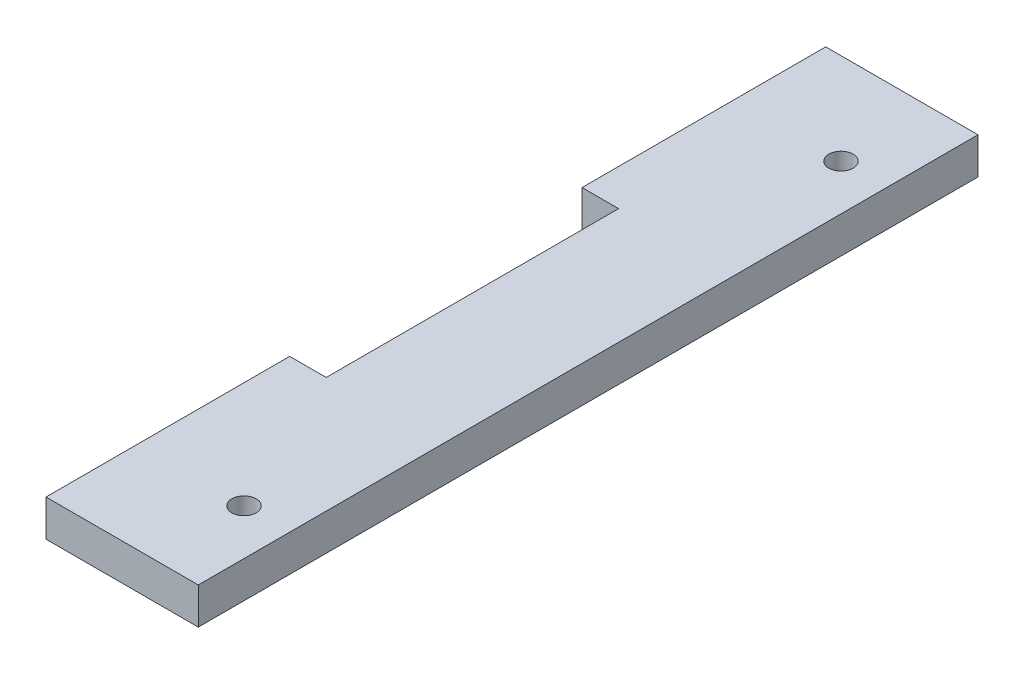
ISO-10303-21;
HEADER;
FILE_DESCRIPTION(('STEP AP214'),'2;1');
FILE_NAME('part.step','',(''),(''),'','','');
FILE_SCHEMA(('AUTOMOTIVE_DESIGN { 1 0 10303 214 1 1 1 1 }'));
ENDSEC;
DATA;
#1=APPLICATION_CONTEXT('core data for automotive mechanical design processes');
#2=APPLICATION_PROTOCOL_DEFINITION('international standard','automotive_design',2000,#1);
#3=PRODUCT_CONTEXT('',#1,'mechanical');
#4=PRODUCT('Part','Part','',(#3));
#5=PRODUCT_RELATED_PRODUCT_CATEGORY('part','',(#4));
#6=PRODUCT_DEFINITION_FORMATION('','',#4);
#7=PRODUCT_DEFINITION_CONTEXT('part definition',#1,'design');
#8=PRODUCT_DEFINITION('design','',#6,#7);
#9=PRODUCT_DEFINITION_SHAPE('','',#8);
#10=(LENGTH_UNIT() NAMED_UNIT(*) SI_UNIT(.MILLI.,.METRE.));
#11=(NAMED_UNIT(*) PLANE_ANGLE_UNIT() SI_UNIT($,.RADIAN.));
#12=(NAMED_UNIT(*) SI_UNIT($,.STERADIAN.) SOLID_ANGLE_UNIT());
#13=UNCERTAINTY_MEASURE_WITH_UNIT(LENGTH_MEASURE(1.E-05),#10,'distance_accuracy_value','');
#14=(GEOMETRIC_REPRESENTATION_CONTEXT(3) GLOBAL_UNCERTAINTY_ASSIGNED_CONTEXT((#13)) GLOBAL_UNIT_ASSIGNED_CONTEXT((#10,
#11,#12)) REPRESENTATION_CONTEXT('',''));
#15=CARTESIAN_POINT('',(0.,0.,0.));
#16=DIRECTION('',(0.,0.,1.));
#17=DIRECTION('',(1.,0.,0.));
#18=AXIS2_PLACEMENT_3D('',#15,#16,#17);
#19=CARTESIAN_POINT('',(-7.31621621621624,6.,0.));
#20=DIRECTION('',(1.,0.,0.));
#21=DIRECTION('',(0.,0.,-1.));
#22=AXIS2_PLACEMENT_3D('',#19,#20,#21);
#23=PLANE('',#22);
#24=DIRECTION('',(0.,0.,1.));
#25=VECTOR('',#24,1.);
#26=CARTESIAN_POINT('',(-7.31621621621624,0.,0.));
#27=LINE('',#26,#25);
#28=CARTESIAN_POINT('',(-7.31621621621624,0.,-21.6054054054054));
#29=VERTEX_POINT('',#28);
#30=CARTESIAN_POINT('',(-7.31621621621624,0.,26.3945945945946));
#31=VERTEX_POINT('',#30);
#32=EDGE_CURVE('E133',#29,#31,#27,.T.);
#33=ORIENTED_EDGE('',*,*,#32,.T.);
#34=DIRECTION('',(0.,-1.,0.));
#35=VECTOR('',#34,1.);
#36=CARTESIAN_POINT('',(-7.31621621621624,6.,26.3945945945946));
#37=LINE('',#36,#35);
#38=CARTESIAN_POINT('',(-7.31621621621624,6.,26.3945945945946));
#39=VERTEX_POINT('',#38);
#40=EDGE_CURVE('E11',#39,#31,#37,.T.);
#41=ORIENTED_EDGE('',*,*,#40,.F.);
#42=DIRECTION('',(0.,0.,1.));
#43=VECTOR('',#42,1.);
#44=CARTESIAN_POINT('',(-7.31621621621624,6.,0.));
#45=LINE('',#44,#43);
#46=CARTESIAN_POINT('',(-7.31621621621624,6.,-21.6054054054054));
#47=VERTEX_POINT('',#46);
#48=EDGE_CURVE('E149',#47,#39,#45,.T.);
#49=ORIENTED_EDGE('',*,*,#48,.F.);
#50=DIRECTION('',(0.,-1.,0.));
#51=VECTOR('',#50,1.);
#52=CARTESIAN_POINT('',(-7.31621621621624,6.,-21.6054054054054));
#53=LINE('',#52,#51);
#54=EDGE_CURVE('E132',#47,#29,#53,.T.);
#55=ORIENTED_EDGE('',*,*,#54,.T.);
#56=EDGE_LOOP('',(#33,#41,#49,#55));
#57=FACE_BOUND('',#56,.T.);
#58=ADVANCED_FACE('F35',(#57),#23,.F.);
#59=CARTESIAN_POINT('',(0.,6.,26.3945945945946));
#60=DIRECTION('',(0.,0.,1.));
#61=DIRECTION('',(1.,0.,0.));
#62=AXIS2_PLACEMENT_3D('',#59,#60,#61);
#63=PLANE('',#62);
#64=DIRECTION('',(-1.,0.,0.));
#65=VECTOR('',#64,1.);
#66=CARTESIAN_POINT('',(0.,0.,26.3945945945946));
#67=LINE('',#66,#65);
#68=CARTESIAN_POINT('',(-13.3162162162162,0.,26.3945945945946));
#69=VERTEX_POINT('',#68);
#70=EDGE_CURVE('E136',#31,#69,#67,.T.);
#71=ORIENTED_EDGE('',*,*,#70,.T.);
#72=DIRECTION('',(0.,-1.,0.));
#73=VECTOR('',#72,1.);
#74=CARTESIAN_POINT('',(-13.3162162162162,6.,26.3945945945946));
#75=LINE('',#74,#73);
#76=CARTESIAN_POINT('',(-13.3162162162162,6.,26.3945945945946));
#77=VERTEX_POINT('',#76);
#78=EDGE_CURVE('E43',#77,#69,#75,.T.);
#79=ORIENTED_EDGE('',*,*,#78,.F.);
#80=DIRECTION('',(-1.,0.,0.));
#81=VECTOR('',#80,1.);
#82=CARTESIAN_POINT('',(0.,6.,26.3945945945946));
#83=LINE('',#82,#81);
#84=EDGE_CURVE('E93',#39,#77,#83,.T.);
#85=ORIENTED_EDGE('',*,*,#84,.F.);
#86=ORIENTED_EDGE('',*,*,#40,.T.);
#87=EDGE_LOOP('',(#71,#79,#85,#86));
#88=FACE_BOUND('',#87,.T.);
#89=ADVANCED_FACE('F211',(#88),#63,.F.);
#90=CARTESIAN_POINT('',(-13.3162162162162,6.,0.));
#91=DIRECTION('',(1.,0.,0.));
#92=DIRECTION('',(0.,0.,-1.));
#93=AXIS2_PLACEMENT_3D('',#90,#91,#92);
#94=PLANE('',#93);
#95=DIRECTION('',(0.,0.,1.));
#96=VECTOR('',#95,1.);
#97=CARTESIAN_POINT('',(-13.3162162162162,0.,0.));
#98=LINE('',#97,#96);
#99=CARTESIAN_POINT('',(-13.3162162162162,0.,66.3945945945946));
#100=VERTEX_POINT('',#99);
#101=EDGE_CURVE('E139',#69,#100,#98,.T.);
#102=ORIENTED_EDGE('',*,*,#101,.T.);
#103=DIRECTION('',(0.,-1.,0.));
#104=VECTOR('',#103,1.);
#105=CARTESIAN_POINT('',(-13.3162162162162,6.,66.3945945945946));
#106=LINE('',#105,#104);
#107=CARTESIAN_POINT('',(-13.3162162162162,6.,66.3945945945946));
#108=VERTEX_POINT('',#107);
#109=EDGE_CURVE('E155',#108,#100,#106,.T.);
#110=ORIENTED_EDGE('',*,*,#109,.F.);
#111=DIRECTION('',(0.,0.,1.));
#112=VECTOR('',#111,1.);
#113=CARTESIAN_POINT('',(-13.3162162162162,6.,0.));
#114=LINE('',#113,#112);
#115=EDGE_CURVE('E121',#77,#108,#114,.T.);
#116=ORIENTED_EDGE('',*,*,#115,.F.);
#117=ORIENTED_EDGE('',*,*,#78,.T.);
#118=EDGE_LOOP('',(#102,#110,#116,#117));
#119=FACE_BOUND('',#118,.T.);
#120=ADVANCED_FACE('F161',(#119),#94,.F.);
#121=CARTESIAN_POINT('',(0.,6.,66.3945945945946));
#122=DIRECTION('',(0.,0.,-1.));
#123=DIRECTION('',(-1.,0.,0.));
#124=AXIS2_PLACEMENT_3D('',#121,#122,#123);
#125=PLANE('',#124);
#126=DIRECTION('',(1.,0.,0.));
#127=VECTOR('',#126,1.);
#128=CARTESIAN_POINT('',(0.,0.,66.3945945945946));
#129=LINE('',#128,#127);
#130=CARTESIAN_POINT('',(11.6837837837838,0.,66.3945945945946));
#131=VERTEX_POINT('',#130);
#132=EDGE_CURVE('E141',#100,#131,#129,.T.);
#133=ORIENTED_EDGE('',*,*,#132,.T.);
#134=DIRECTION('',(0.,-1.,0.));
#135=VECTOR('',#134,1.);
#136=CARTESIAN_POINT('',(11.6837837837838,6.,66.3945945945946));
#137=LINE('',#136,#135);
#138=CARTESIAN_POINT('',(11.6837837837838,6.,66.3945945945946));
#139=VERTEX_POINT('',#138);
#140=EDGE_CURVE('E153',#139,#131,#137,.T.);
#141=ORIENTED_EDGE('',*,*,#140,.F.);
#142=DIRECTION('',(1.,0.,0.));
#143=VECTOR('',#142,1.);
#144=CARTESIAN_POINT('',(0.,6.,66.3945945945946));
#145=LINE('',#144,#143);
#146=EDGE_CURVE('E127',#108,#139,#145,.T.);
#147=ORIENTED_EDGE('',*,*,#146,.F.);
#148=ORIENTED_EDGE('',*,*,#109,.T.);
#149=EDGE_LOOP('',(#133,#141,#147,#148));
#150=FACE_BOUND('',#149,.T.);
#151=ADVANCED_FACE('F170',(#150),#125,.F.);
#152=CARTESIAN_POINT('',(11.6837837837838,6.,0.));
#153=DIRECTION('',(1.,0.,0.));
#154=DIRECTION('',(0.,0.,-1.));
#155=AXIS2_PLACEMENT_3D('',#152,#153,#154);
#156=PLANE('',#155);
#157=DIRECTION('',(0.,0.,1.));
#158=VECTOR('',#157,1.);
#159=CARTESIAN_POINT('',(11.6837837837838,0.,0.));
#160=LINE('',#159,#158);
#161=CARTESIAN_POINT('',(11.6837837837838,0.,-61.6054054054054));
#162=VERTEX_POINT('',#161);
#163=EDGE_CURVE('E144',#162,#131,#160,.T.);
#164=ORIENTED_EDGE('',*,*,#163,.F.);
#165=DIRECTION('',(0.,-1.,0.));
#166=VECTOR('',#165,1.);
#167=CARTESIAN_POINT('',(11.6837837837838,6.,-61.6054054054054));
#168=LINE('',#167,#166);
#169=CARTESIAN_POINT('',(11.6837837837838,6.,-61.6054054054054));
#170=VERTEX_POINT('',#169);
#171=EDGE_CURVE('E115',#170,#162,#168,.T.);
#172=ORIENTED_EDGE('',*,*,#171,.F.);
#173=DIRECTION('',(0.,0.,1.));
#174=VECTOR('',#173,1.);
#175=CARTESIAN_POINT('',(11.6837837837838,6.,0.));
#176=LINE('',#175,#174);
#177=EDGE_CURVE('E125',#170,#139,#176,.T.);
#178=ORIENTED_EDGE('',*,*,#177,.T.);
#179=ORIENTED_EDGE('',*,*,#140,.T.);
#180=EDGE_LOOP('',(#164,#172,#178,#179));
#181=FACE_BOUND('',#180,.T.);
#182=ADVANCED_FACE('F227',(#181),#156,.T.);
#183=CARTESIAN_POINT('',(0.,6.,-61.6054054054054));
#184=DIRECTION('',(0.,0.,-1.));
#185=DIRECTION('',(-1.,0.,0.));
#186=AXIS2_PLACEMENT_3D('',#183,#184,#185);
#187=PLANE('',#186);
#188=DIRECTION('',(1.,0.,0.));
#189=VECTOR('',#188,1.);
#190=CARTESIAN_POINT('',(0.,0.,-61.6054054054054));
#191=LINE('',#190,#189);
#192=CARTESIAN_POINT('',(-13.3162162162162,0.,-61.6054054054054));
#193=VERTEX_POINT('',#192);
#194=EDGE_CURVE('E114',#193,#162,#191,.T.);
#195=ORIENTED_EDGE('',*,*,#194,.F.);
#196=DIRECTION('',(0.,-1.,0.));
#197=VECTOR('',#196,1.);
#198=CARTESIAN_POINT('',(-13.3162162162162,6.,-61.6054054054054));
#199=LINE('',#198,#197);
#200=CARTESIAN_POINT('',(-13.3162162162162,6.,-61.6054054054054));
#201=VERTEX_POINT('',#200);
#202=EDGE_CURVE('E108',#201,#193,#199,.T.);
#203=ORIENTED_EDGE('',*,*,#202,.F.);
#204=DIRECTION('',(1.,0.,0.));
#205=VECTOR('',#204,1.);
#206=CARTESIAN_POINT('',(0.,6.,-61.6054054054054));
#207=LINE('',#206,#205);
#208=EDGE_CURVE('E112',#201,#170,#207,.T.);
#209=ORIENTED_EDGE('',*,*,#208,.T.);
#210=ORIENTED_EDGE('',*,*,#171,.T.);
#211=EDGE_LOOP('',(#195,#203,#209,#210));
#212=FACE_BOUND('',#211,.T.);
#213=ADVANCED_FACE('F110',(#212),#187,.T.);
#214=CARTESIAN_POINT('',(-13.3162162162162,0.,-21.6054054054054));
#215=VERTEX_POINT('',#214);
#216=EDGE_CURVE('E79',#193,#215,#98,.T.);
#217=ORIENTED_EDGE('',*,*,#216,.T.);
#218=DIRECTION('',(0.,-1.,0.));
#219=VECTOR('',#218,1.);
#220=CARTESIAN_POINT('',(-13.3162162162162,6.,-21.6054054054054));
#221=LINE('',#220,#219);
#222=CARTESIAN_POINT('',(-13.3162162162162,6.,-21.6054054054054));
#223=VERTEX_POINT('',#222);
#224=EDGE_CURVE('E116',#223,#215,#221,.T.);
#225=ORIENTED_EDGE('',*,*,#224,.F.);
#226=EDGE_CURVE('E118',#201,#223,#114,.T.);
#227=ORIENTED_EDGE('',*,*,#226,.F.);
#228=ORIENTED_EDGE('',*,*,#202,.T.);
#229=EDGE_LOOP('',(#217,#225,#227,#228));
#230=FACE_BOUND('',#229,.T.);
#231=ADVANCED_FACE('F119',(#230),#94,.F.);
#232=CARTESIAN_POINT('',(0.,6.,-21.6054054054054));
#233=DIRECTION('',(0.,0.,-1.));
#234=DIRECTION('',(-1.,0.,0.));
#235=AXIS2_PLACEMENT_3D('',#232,#233,#234);
#236=PLANE('',#235);
#237=DIRECTION('',(1.,0.,0.));
#238=VECTOR('',#237,1.);
#239=CARTESIAN_POINT('',(0.,0.,-21.6054054054054));
#240=LINE('',#239,#238);
#241=EDGE_CURVE('E85',#215,#29,#240,.T.);
#242=ORIENTED_EDGE('',*,*,#241,.T.);
#243=ORIENTED_EDGE('',*,*,#54,.F.);
#244=DIRECTION('',(1.,0.,0.));
#245=VECTOR('',#244,1.);
#246=CARTESIAN_POINT('',(0.,6.,-21.6054054054054));
#247=LINE('',#246,#245);
#248=EDGE_CURVE('E51',#223,#47,#247,.T.);
#249=ORIENTED_EDGE('',*,*,#248,.F.);
#250=ORIENTED_EDGE('',*,*,#224,.T.);
#251=EDGE_LOOP('',(#242,#243,#249,#250));
#252=FACE_BOUND('',#251,.T.);
#253=ADVANCED_FACE('F198',(#252),#236,.F.);
#254=CARTESIAN_POINT('',(0.,6.,0.));
#255=DIRECTION('',(0.,1.,0.));
#256=DIRECTION('',(0.,0.,1.));
#257=AXIS2_PLACEMENT_3D('',#254,#255,#256);
#258=PLANE('',#257);
#259=CARTESIAN_POINT('',(4.18378378378376,6.,-46.6054054054054));
#260=DIRECTION('',(0.,1.,0.));
#261=DIRECTION('',(0.,0.,1.));
#262=AXIS2_PLACEMENT_3D('',#259,#260,#261);
#263=CIRCLE('',#262,2.);
#264=CARTESIAN_POINT('',(4.18378378378376,6.,-44.6054054054054));
#265=VERTEX_POINT('',#264);
#266=EDGE_CURVE('E181',#265,#265,#263,.T.);
#267=ORIENTED_EDGE('',*,*,#266,.F.);
#268=EDGE_LOOP('',(#267));
#269=FACE_BOUND('',#268,.T.);
#270=CARTESIAN_POINT('',(4.18378378378375,6.,51.3945945945946));
#271=DIRECTION('',(0.,1.,0.));
#272=DIRECTION('',(0.,0.,1.));
#273=AXIS2_PLACEMENT_3D('',#270,#271,#272);
#274=CIRCLE('',#273,2.);
#275=CARTESIAN_POINT('',(4.18378378378375,6.,53.3945945945946));
#276=VERTEX_POINT('',#275);
#277=EDGE_CURVE('E175',#276,#276,#274,.T.);
#278=ORIENTED_EDGE('',*,*,#277,.F.);
#279=EDGE_LOOP('',(#278));
#280=FACE_BOUND('',#279,.T.);
#281=ORIENTED_EDGE('',*,*,#48,.T.);
#282=ORIENTED_EDGE('',*,*,#84,.T.);
#283=ORIENTED_EDGE('',*,*,#115,.T.);
#284=ORIENTED_EDGE('',*,*,#146,.T.);
#285=ORIENTED_EDGE('',*,*,#177,.F.);
#286=ORIENTED_EDGE('',*,*,#208,.F.);
#287=ORIENTED_EDGE('',*,*,#226,.T.);
#288=ORIENTED_EDGE('',*,*,#248,.T.);
#289=EDGE_LOOP('',(#281,#282,#283,#284,#285,#286,#287,#288));
#290=FACE_BOUND('',#289,.T.);
#291=ADVANCED_FACE('F123',(#269,#280,#290),#258,.T.);
#292=CARTESIAN_POINT('',(0.,0.,0.));
#293=DIRECTION('',(0.,1.,0.));
#294=DIRECTION('',(0.,0.,1.));
#295=AXIS2_PLACEMENT_3D('',#292,#293,#294);
#296=PLANE('',#295);
#297=CARTESIAN_POINT('',(4.18378378378376,0.,-46.6054054054054));
#298=DIRECTION('',(0.,1.,0.));
#299=DIRECTION('',(0.,0.,1.));
#300=AXIS2_PLACEMENT_3D('',#297,#298,#299);
#301=CIRCLE('',#300,2.);
#302=CARTESIAN_POINT('',(4.18378378378376,0.,-44.6054054054054));
#303=VERTEX_POINT('',#302);
#304=EDGE_CURVE('E178',#303,#303,#301,.T.);
#305=ORIENTED_EDGE('',*,*,#304,.T.);
#306=EDGE_LOOP('',(#305));
#307=FACE_BOUND('',#306,.T.);
#308=CARTESIAN_POINT('',(4.18378378378375,0.,51.3945945945946));
#309=DIRECTION('',(0.,1.,0.));
#310=DIRECTION('',(0.,0.,1.));
#311=AXIS2_PLACEMENT_3D('',#308,#309,#310);
#312=CIRCLE('',#311,2.);
#313=CARTESIAN_POINT('',(4.18378378378375,0.,53.3945945945946));
#314=VERTEX_POINT('',#313);
#315=EDGE_CURVE('E137',#314,#314,#312,.T.);
#316=ORIENTED_EDGE('',*,*,#315,.T.);
#317=EDGE_LOOP('',(#316));
#318=FACE_BOUND('',#317,.T.);
#319=ORIENTED_EDGE('',*,*,#32,.F.);
#320=ORIENTED_EDGE('',*,*,#241,.F.);
#321=ORIENTED_EDGE('',*,*,#216,.F.);
#322=ORIENTED_EDGE('',*,*,#194,.T.);
#323=ORIENTED_EDGE('',*,*,#163,.T.);
#324=ORIENTED_EDGE('',*,*,#132,.F.);
#325=ORIENTED_EDGE('',*,*,#101,.F.);
#326=ORIENTED_EDGE('',*,*,#70,.F.);
#327=EDGE_LOOP('',(#319,#320,#321,#322,#323,#324,#325,#326));
#328=FACE_BOUND('',#327,.T.);
#329=ADVANCED_FACE('F166',(#307,#318,#328),#296,.F.);
#330=CARTESIAN_POINT('',(4.18378378378375,0.,51.3945945945946));
#331=DIRECTION('',(0.,1.,0.));
#332=DIRECTION('',(0.,0.,1.));
#333=AXIS2_PLACEMENT_3D('',#330,#331,#332);
#334=CYLINDRICAL_SURFACE('',#333,2.);
#335=ORIENTED_EDGE('',*,*,#315,.F.);
#336=EDGE_LOOP('',(#335));
#337=FACE_BOUND('',#336,.T.);
#338=ORIENTED_EDGE('',*,*,#277,.T.);
#339=EDGE_LOOP('',(#338));
#340=FACE_BOUND('',#339,.T.);
#341=ADVANCED_FACE('F192',(#337,#340),#334,.F.);
#342=CARTESIAN_POINT('',(4.18378378378376,0.,-46.6054054054054));
#343=DIRECTION('',(0.,1.,0.));
#344=DIRECTION('',(0.,0.,1.));
#345=AXIS2_PLACEMENT_3D('',#342,#343,#344);
#346=CYLINDRICAL_SURFACE('',#345,2.);
#347=ORIENTED_EDGE('',*,*,#304,.F.);
#348=EDGE_LOOP('',(#347));
#349=FACE_BOUND('',#348,.T.);
#350=ORIENTED_EDGE('',*,*,#266,.T.);
#351=EDGE_LOOP('',(#350));
#352=FACE_BOUND('',#351,.T.);
#353=ADVANCED_FACE('F189',(#349,#352),#346,.F.);
#354=CLOSED_SHELL('',(#58,#89,#120,#151,#182,#213,#231,#253,#291,#329,#341,#353));
#355=MANIFOLD_SOLID_BREP('B2',#354);
#356=ADVANCED_BREP_SHAPE_REPRESENTATION('',(#18,#355),#14);
#357=SHAPE_DEFINITION_REPRESENTATION(#9,#356);
ENDSEC;
END-ISO-10303-21;
